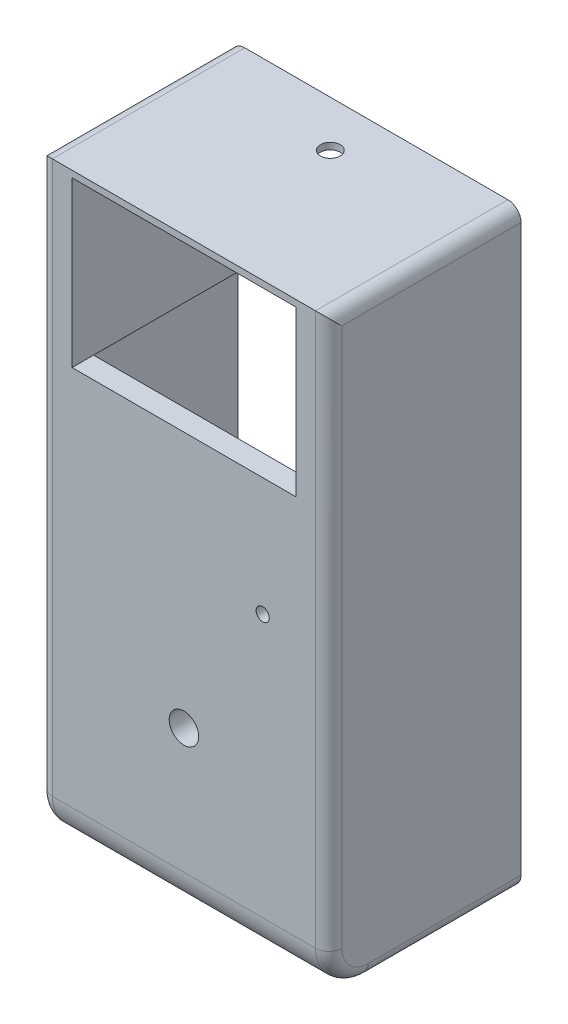
ISO-10303-21;
HEADER;
FILE_DESCRIPTION(('STEP AP214'),'2;1');
FILE_NAME('part.step','',(''),(''),'','','');
FILE_SCHEMA(('AUTOMOTIVE_DESIGN { 1 0 10303 214 1 1 1 1 }'));
ENDSEC;
DATA;
#1=APPLICATION_CONTEXT('core data for automotive mechanical design processes');
#2=APPLICATION_PROTOCOL_DEFINITION('international standard','automotive_design',2000,#1);
#3=PRODUCT_CONTEXT('',#1,'mechanical');
#4=PRODUCT('Part','Part','',(#3));
#5=PRODUCT_RELATED_PRODUCT_CATEGORY('part','',(#4));
#6=PRODUCT_DEFINITION_FORMATION('','',#4);
#7=PRODUCT_DEFINITION_CONTEXT('part definition',#1,'design');
#8=PRODUCT_DEFINITION('design','',#6,#7);
#9=PRODUCT_DEFINITION_SHAPE('','',#8);
#10=(LENGTH_UNIT() NAMED_UNIT(*) SI_UNIT(.MILLI.,.METRE.));
#11=(NAMED_UNIT(*) PLANE_ANGLE_UNIT() SI_UNIT($,.RADIAN.));
#12=(NAMED_UNIT(*) SI_UNIT($,.STERADIAN.) SOLID_ANGLE_UNIT());
#13=UNCERTAINTY_MEASURE_WITH_UNIT(LENGTH_MEASURE(1.E-05),#10,'distance_accuracy_value','');
#14=(GEOMETRIC_REPRESENTATION_CONTEXT(3) GLOBAL_UNCERTAINTY_ASSIGNED_CONTEXT((#13)) GLOBAL_UNIT_ASSIGNED_CONTEXT((#10,
#11,#12)) REPRESENTATION_CONTEXT('',''));
#15=CARTESIAN_POINT('',(0.,0.,0.));
#16=DIRECTION('',(0.,0.,1.));
#17=DIRECTION('',(1.,0.,0.));
#18=AXIS2_PLACEMENT_3D('',#15,#16,#17);
#19=CARTESIAN_POINT('',(380.4,-260.,260.));
#20=DIRECTION('',(0.,1.,0.));
#21=DIRECTION('',(0.,0.,1.));
#22=AXIS2_PLACEMENT_3D('',#19,#20,#21);
#23=PLANE('',#22);
#24=DIRECTION('',(1.,0.,0.));
#25=VECTOR('',#24,1.);
#26=CARTESIAN_POINT('',(380.4,-260.,260.));
#27=LINE('',#26,#25);
#28=CARTESIAN_POINT('',(340.4,-260.,260.));
#29=VERTEX_POINT('',#28);
#30=CARTESIAN_POINT('',(380.4,-260.,260.));
#31=VERTEX_POINT('',#30);
#32=EDGE_CURVE('E241',#29,#31,#27,.T.);
#33=ORIENTED_EDGE('',*,*,#32,.F.);
#34=DIRECTION('',(0.,0.,1.));
#35=VECTOR('',#34,1.);
#36=CARTESIAN_POINT('',(340.4,-260.,0.));
#37=LINE('',#36,#35);
#38=CARTESIAN_POINT('',(340.4,-260.,0.));
#39=VERTEX_POINT('',#38);
#40=EDGE_CURVE('E230',#39,#29,#37,.T.);
#41=ORIENTED_EDGE('',*,*,#40,.F.);
#42=DIRECTION('',(1.,0.,0.));
#43=VECTOR('',#42,1.);
#44=CARTESIAN_POINT('',(380.4,-260.,0.));
#45=LINE('',#44,#43);
#46=CARTESIAN_POINT('',(380.4,-260.,0.));
#47=VERTEX_POINT('',#46);
#48=EDGE_CURVE('E260',#39,#47,#45,.T.);
#49=ORIENTED_EDGE('',*,*,#48,.T.);
#50=DIRECTION('',(0.,0.,-1.));
#51=VECTOR('',#50,1.);
#52=CARTESIAN_POINT('',(380.4,-260.,260.));
#53=LINE('',#52,#51);
#54=EDGE_CURVE('E278',#31,#47,#53,.T.);
#55=ORIENTED_EDGE('',*,*,#54,.F.);
#56=EDGE_LOOP('',(#33,#41,#49,#55));
#57=FACE_BOUND('',#56,.T.);
#58=ADVANCED_FACE('F51',(#57),#23,.F.);
#59=CARTESIAN_POINT('',(-50.,0.,292.7));
#60=DIRECTION('',(-1.,0.,0.));
#61=DIRECTION('',(0.,0.,1.));
#62=AXIS2_PLACEMENT_3D('',#59,#60,#61);
#63=PLANE('',#62);
#64=CARTESIAN_POINT('',(-50.,-840.,232.7));
#65=DIRECTION('',(-1.,0.,0.));
#66=DIRECTION('',(0.,0.,1.));
#67=AXIS2_PLACEMENT_3D('',#64,#65,#66);
#68=CIRCLE('',#67,40.);
#69=CARTESIAN_POINT('',(-50.,-840.,272.7));
#70=VERTEX_POINT('',#69);
#71=CARTESIAN_POINT('',(-50.,-880.,232.7));
#72=VERTEX_POINT('',#71);
#73=EDGE_CURVE('E395',#70,#72,#68,.F.);
#74=ORIENTED_EDGE('',*,*,#73,.F.);
#75=DIRECTION('',(0.,1.,0.));
#76=VECTOR('',#75,1.);
#77=CARTESIAN_POINT('',(-50.,0.,272.7));
#78=LINE('',#77,#76);
#79=CARTESIAN_POINT('',(-50.,-20.,272.7));
#80=VERTEX_POINT('',#79);
#81=EDGE_CURVE('E356',#70,#80,#78,.T.);
#82=ORIENTED_EDGE('',*,*,#81,.T.);
#83=DIRECTION('',(0.,0.,-1.));
#84=VECTOR('',#83,1.);
#85=CARTESIAN_POINT('',(-50.,-20.,0.));
#86=LINE('',#85,#84);
#87=CARTESIAN_POINT('',(-50.,-20.,0.));
#88=VERTEX_POINT('',#87);
#89=EDGE_CURVE('E359',#80,#88,#86,.T.);
#90=ORIENTED_EDGE('',*,*,#89,.T.);
#91=DIRECTION('',(0.,1.,0.));
#92=VECTOR('',#91,1.);
#93=CARTESIAN_POINT('',(-50.,0.,0.));
#94=LINE('',#93,#92);
#95=CARTESIAN_POINT('',(-50.,-880.,0.));
#96=VERTEX_POINT('',#95);
#97=EDGE_CURVE('E303',#96,#88,#94,.T.);
#98=ORIENTED_EDGE('',*,*,#97,.F.);
#99=DIRECTION('',(0.,0.,-1.));
#100=VECTOR('',#99,1.);
#101=CARTESIAN_POINT('',(-50.,-880.,292.7));
#102=LINE('',#101,#100);
#103=EDGE_CURVE('E352',#96,#72,#102,.F.);
#104=ORIENTED_EDGE('',*,*,#103,.T.);
#105=EDGE_LOOP('',(#74,#82,#90,#98,#104));
#106=FACE_BOUND('',#105,.T.);
#107=ADVANCED_FACE('F481',(#106),#63,.T.);
#108=CARTESIAN_POINT('',(390.4,0.,292.7));
#109=DIRECTION('',(1.,0.,0.));
#110=DIRECTION('',(0.,1.,0.));
#111=AXIS2_PLACEMENT_3D('',#108,#109,#110);
#112=PLANE('',#111);
#113=CARTESIAN_POINT('',(390.4,-840.,232.7));
#114=DIRECTION('',(1.,0.,0.));
#115=DIRECTION('',(0.,1.,0.));
#116=AXIS2_PLACEMENT_3D('',#113,#114,#115);
#117=CIRCLE('',#116,40.);
#118=CARTESIAN_POINT('',(390.4,-880.,232.7));
#119=VERTEX_POINT('',#118);
#120=CARTESIAN_POINT('',(390.4,-840.,272.7));
#121=VERTEX_POINT('',#120);
#122=EDGE_CURVE('E377',#119,#121,#117,.F.);
#123=ORIENTED_EDGE('',*,*,#122,.F.);
#124=DIRECTION('',(0.,0.,-1.));
#125=VECTOR('',#124,1.);
#126=CARTESIAN_POINT('',(390.4,-880.,0.));
#127=LINE('',#126,#125);
#128=CARTESIAN_POINT('',(390.4,-880.,0.));
#129=VERTEX_POINT('',#128);
#130=EDGE_CURVE('E342',#119,#129,#127,.T.);
#131=ORIENTED_EDGE('',*,*,#130,.T.);
#132=DIRECTION('',(0.,-1.,0.));
#133=VECTOR('',#132,1.);
#134=CARTESIAN_POINT('',(390.4,0.,0.));
#135=LINE('',#134,#133);
#136=CARTESIAN_POINT('',(390.4,-20.,0.));
#137=VERTEX_POINT('',#136);
#138=EDGE_CURVE('E298',#137,#129,#135,.T.);
#139=ORIENTED_EDGE('',*,*,#138,.F.);
#140=DIRECTION('',(0.,0.,-1.));
#141=VECTOR('',#140,1.);
#142=CARTESIAN_POINT('',(390.4,-20.,292.7));
#143=LINE('',#142,#141);
#144=CARTESIAN_POINT('',(390.4,-20.,272.7));
#145=VERTEX_POINT('',#144);
#146=EDGE_CURVE('E349',#137,#145,#143,.F.);
#147=ORIENTED_EDGE('',*,*,#146,.T.);
#148=DIRECTION('',(0.,-1.,0.));
#149=VECTOR('',#148,1.);
#150=CARTESIAN_POINT('',(390.4,0.,272.7));
#151=LINE('',#150,#149);
#152=EDGE_CURVE('E345',#145,#121,#151,.T.);
#153=ORIENTED_EDGE('',*,*,#152,.T.);
#154=EDGE_LOOP('',(#123,#131,#139,#147,#153));
#155=FACE_BOUND('',#154,.T.);
#156=ADVANCED_FACE('F466',(#155),#112,.T.);
#157=CARTESIAN_POINT('',(1.10218211923262E-13,-900.,292.7));
#158=DIRECTION('',(0.,1.,0.));
#159=DIRECTION('',(0.,0.,1.));
#160=AXIS2_PLACEMENT_3D('',#157,#158,#159);
#161=PLANE('',#160);
#162=DIRECTION('',(0.,0.,-1.));
#163=VECTOR('',#162,1.);
#164=CARTESIAN_POINT('',(370.4,-900.,292.7));
#165=LINE('',#164,#163);
#166=CARTESIAN_POINT('',(370.4,-900.,0.));
#167=VERTEX_POINT('',#166);
#168=CARTESIAN_POINT('',(370.4,-900.,232.7));
#169=VERTEX_POINT('',#168);
#170=EDGE_CURVE('E370',#167,#169,#165,.F.);
#171=ORIENTED_EDGE('',*,*,#170,.T.);
#172=DIRECTION('',(1.,0.,0.));
#173=VECTOR('',#172,1.);
#174=CARTESIAN_POINT('',(-30.,-900.,232.7));
#175=LINE('',#174,#173);
#176=CARTESIAN_POINT('',(-30.,-900.,232.7));
#177=VERTEX_POINT('',#176);
#178=EDGE_CURVE('E11',#169,#177,#175,.F.);
#179=ORIENTED_EDGE('',*,*,#178,.T.);
#180=DIRECTION('',(0.,0.,-1.));
#181=VECTOR('',#180,1.);
#182=CARTESIAN_POINT('',(-30.,-900.,0.));
#183=LINE('',#182,#181);
#184=CARTESIAN_POINT('',(-30.,-900.,0.));
#185=VERTEX_POINT('',#184);
#186=EDGE_CURVE('E374',#177,#185,#183,.T.);
#187=ORIENTED_EDGE('',*,*,#186,.T.);
#188=DIRECTION('',(1.,0.,0.));
#189=VECTOR('',#188,1.);
#190=CARTESIAN_POINT('',(1.10218211923262E-13,-900.,0.));
#191=LINE('',#190,#189);
#192=EDGE_CURVE('E311',#185,#167,#191,.T.);
#193=ORIENTED_EDGE('',*,*,#192,.T.);
#194=EDGE_LOOP('',(#171,#179,#187,#193));
#195=FACE_BOUND('',#194,.T.);
#196=ADVANCED_FACE('F560',(#195),#161,.F.);
#197=CARTESIAN_POINT('',(0.,0.,292.7));
#198=DIRECTION('',(0.,-1.,0.));
#199=DIRECTION('',(0.,0.,-1.));
#200=AXIS2_PLACEMENT_3D('',#197,#198,#199);
#201=PLANE('',#200);
#202=CARTESIAN_POINT('',(170.2,0.,70.));
#203=DIRECTION('',(0.,1.,0.));
#204=DIRECTION('',(0.,0.,1.));
#205=AXIS2_PLACEMENT_3D('',#202,#203,#204);
#206=CIRCLE('',#205,15.);
#207=CARTESIAN_POINT('',(170.2,0.,85.0000000000001));
#208=VERTEX_POINT('',#207);
#209=EDGE_CURVE('E289',#208,#208,#206,.T.);
#210=ORIENTED_EDGE('',*,*,#209,.F.);
#211=EDGE_LOOP('',(#210));
#212=FACE_BOUND('',#211,.T.);
#213=DIRECTION('',(-1.,0.,0.));
#214=VECTOR('',#213,1.);
#215=CARTESIAN_POINT('',(0.,0.,292.7));
#216=LINE('',#215,#214);
#217=CARTESIAN_POINT('',(370.4,0.,292.7));
#218=VERTEX_POINT('',#217);
#219=CARTESIAN_POINT('',(-30.,0.,292.7));
#220=VERTEX_POINT('',#219);
#221=EDGE_CURVE('E312',#218,#220,#216,.T.);
#222=ORIENTED_EDGE('',*,*,#221,.F.);
#223=DIRECTION('',(0.,0.,-1.));
#224=VECTOR('',#223,1.);
#225=CARTESIAN_POINT('',(370.4,0.,0.));
#226=LINE('',#225,#224);
#227=CARTESIAN_POINT('',(370.4,0.,0.));
#228=VERTEX_POINT('',#227);
#229=EDGE_CURVE('E326',#218,#228,#226,.T.);
#230=ORIENTED_EDGE('',*,*,#229,.T.);
#231=DIRECTION('',(-1.,0.,0.));
#232=VECTOR('',#231,1.);
#233=CARTESIAN_POINT('',(0.,0.,0.));
#234=LINE('',#233,#232);
#235=CARTESIAN_POINT('',(-30.,0.,0.));
#236=VERTEX_POINT('',#235);
#237=EDGE_CURVE('E317',#228,#236,#234,.T.);
#238=ORIENTED_EDGE('',*,*,#237,.T.);
#239=DIRECTION('',(0.,0.,-1.));
#240=VECTOR('',#239,1.);
#241=CARTESIAN_POINT('',(-30.,0.,292.7));
#242=LINE('',#241,#240);
#243=EDGE_CURVE('E316',#236,#220,#242,.F.);
#244=ORIENTED_EDGE('',*,*,#243,.T.);
#245=EDGE_LOOP('',(#222,#230,#238,#244));
#246=FACE_BOUND('',#245,.T.);
#247=ADVANCED_FACE('F440',(#212,#246),#201,.F.);
#248=CARTESIAN_POINT('',(0.,0.,292.7));
#249=DIRECTION('',(0.,0.,1.));
#250=DIRECTION('',(1.,0.,0.));
#251=AXIS2_PLACEMENT_3D('',#248,#249,#250);
#252=PLANE('',#251);
#253=DIRECTION('',(0.,1.,0.));
#254=VECTOR('',#253,1.);
#255=CARTESIAN_POINT('',(340.4,-260.,292.7));
#256=LINE('',#255,#254);
#257=CARTESIAN_POINT('',(340.4,-260.,292.7));
#258=VERTEX_POINT('',#257);
#259=CARTESIAN_POINT('',(340.4,-10.,292.7));
#260=VERTEX_POINT('',#259);
#261=EDGE_CURVE('E69',#258,#260,#256,.T.);
#262=ORIENTED_EDGE('',*,*,#261,.F.);
#263=DIRECTION('',(1.,0.,0.));
#264=VECTOR('',#263,1.);
#265=CARTESIAN_POINT('',(0.,-260.,292.7));
#266=LINE('',#265,#264);
#267=CARTESIAN_POINT('',(0.,-260.,292.7));
#268=VERTEX_POINT('',#267);
#269=EDGE_CURVE('E214',#268,#258,#266,.T.);
#270=ORIENTED_EDGE('',*,*,#269,.F.);
#271=DIRECTION('',(0.,-1.,0.));
#272=VECTOR('',#271,1.);
#273=CARTESIAN_POINT('',(0.,-10.0000000000001,292.7));
#274=LINE('',#273,#272);
#275=CARTESIAN_POINT('',(0.,-10.0000000000001,292.7));
#276=VERTEX_POINT('',#275);
#277=EDGE_CURVE('E221',#276,#268,#274,.T.);
#278=ORIENTED_EDGE('',*,*,#277,.F.);
#279=DIRECTION('',(-1.,0.,0.));
#280=VECTOR('',#279,1.);
#281=CARTESIAN_POINT('',(170.2,-10.,292.7));
#282=LINE('',#281,#280);
#283=EDGE_CURVE('E192',#260,#276,#282,.T.);
#284=ORIENTED_EDGE('',*,*,#283,.F.);
#285=EDGE_LOOP('',(#262,#270,#278,#284));
#286=FACE_BOUND('',#285,.T.);
#287=CARTESIAN_POINT('',(290.,-440.,292.7));
#288=DIRECTION('',(0.,0.,1.));
#289=DIRECTION('',(1.,0.,0.));
#290=AXIS2_PLACEMENT_3D('',#287,#288,#289);
#291=CIRCLE('',#290,9.99999999999998);
#292=CARTESIAN_POINT('',(300.,-440.,292.7));
#293=VERTEX_POINT('',#292);
#294=EDGE_CURVE('E293',#293,#293,#291,.T.);
#295=ORIENTED_EDGE('',*,*,#294,.F.);
#296=EDGE_LOOP('',(#295));
#297=FACE_BOUND('',#296,.T.);
#298=CARTESIAN_POINT('',(170.2,-650.,292.7));
#299=DIRECTION('',(0.,0.,1.));
#300=DIRECTION('',(1.,0.,0.));
#301=AXIS2_PLACEMENT_3D('',#298,#299,#300);
#302=CIRCLE('',#301,22.5);
#303=CARTESIAN_POINT('',(192.7,-650.,292.7));
#304=VERTEX_POINT('',#303);
#305=EDGE_CURVE('E302',#304,#304,#302,.T.);
#306=ORIENTED_EDGE('',*,*,#305,.F.);
#307=EDGE_LOOP('',(#306));
#308=FACE_BOUND('',#307,.T.);
#309=DIRECTION('',(0.,1.,0.));
#310=VECTOR('',#309,1.);
#311=CARTESIAN_POINT('',(-30.,0.,292.7));
#312=LINE('',#311,#310);
#313=CARTESIAN_POINT('',(-30.,-840.,292.7));
#314=VERTEX_POINT('',#313);
#315=EDGE_CURVE('E366',#220,#314,#312,.F.);
#316=ORIENTED_EDGE('',*,*,#315,.T.);
#317=DIRECTION('',(1.,0.,0.));
#318=VECTOR('',#317,1.);
#319=CARTESIAN_POINT('',(370.4,-840.,292.7));
#320=LINE('',#319,#318);
#321=CARTESIAN_POINT('',(370.4,-840.,292.7));
#322=VERTEX_POINT('',#321);
#323=EDGE_CURVE('E61',#314,#322,#320,.T.);
#324=ORIENTED_EDGE('',*,*,#323,.T.);
#325=DIRECTION('',(0.,-1.,0.));
#326=VECTOR('',#325,1.);
#327=CARTESIAN_POINT('',(370.4,0.,292.7));
#328=LINE('',#327,#326);
#329=EDGE_CURVE('E363',#322,#218,#328,.F.);
#330=ORIENTED_EDGE('',*,*,#329,.T.);
#331=ORIENTED_EDGE('',*,*,#221,.T.);
#332=EDGE_LOOP('',(#316,#324,#330,#331));
#333=FACE_BOUND('',#332,.T.);
#334=ADVANCED_FACE('F437',(#286,#297,#308,#333),#252,.T.);
#335=CARTESIAN_POINT('',(0.,0.,0.));
#336=DIRECTION('',(0.,0.,1.));
#337=DIRECTION('',(1.,0.,0.));
#338=AXIS2_PLACEMENT_3D('',#335,#336,#337);
#339=PLANE('',#338);
#340=ORIENTED_EDGE('',*,*,#48,.F.);
#341=DIRECTION('',(0.,1.,0.));
#342=VECTOR('',#341,1.);
#343=CARTESIAN_POINT('',(340.4,-260.,0.));
#344=LINE('',#343,#342);
#345=CARTESIAN_POINT('',(340.4,-10.,0.));
#346=VERTEX_POINT('',#345);
#347=EDGE_CURVE('E195',#39,#346,#344,.T.);
#348=ORIENTED_EDGE('',*,*,#347,.T.);
#349=DIRECTION('',(-1.,0.,0.));
#350=VECTOR('',#349,1.);
#351=CARTESIAN_POINT('',(170.2,-10.,0.));
#352=LINE('',#351,#350);
#353=CARTESIAN_POINT('',(0.,-10.0000000000001,0.));
#354=VERTEX_POINT('',#353);
#355=EDGE_CURVE('E189',#346,#354,#352,.T.);
#356=ORIENTED_EDGE('',*,*,#355,.T.);
#357=DIRECTION('',(0.,-1.,0.));
#358=VECTOR('',#357,1.);
#359=CARTESIAN_POINT('',(0.,-10.0000000000001,0.));
#360=LINE('',#359,#358);
#361=CARTESIAN_POINT('',(0.,-260.,0.));
#362=VERTEX_POINT('',#361);
#363=EDGE_CURVE('E198',#354,#362,#360,.T.);
#364=ORIENTED_EDGE('',*,*,#363,.T.);
#365=CARTESIAN_POINT('',(-40.,-260.,0.));
#366=VERTEX_POINT('',#365);
#367=EDGE_CURVE('E261',#366,#362,#45,.T.);
#368=ORIENTED_EDGE('',*,*,#367,.F.);
#369=DIRECTION('',(0.,1.,0.));
#370=VECTOR('',#369,1.);
#371=CARTESIAN_POINT('',(-40.,-890.,0.));
#372=LINE('',#371,#370);
#373=CARTESIAN_POINT('',(-40.,-890.,0.));
#374=VERTEX_POINT('',#373);
#375=EDGE_CURVE('E257',#374,#366,#372,.T.);
#376=ORIENTED_EDGE('',*,*,#375,.F.);
#377=DIRECTION('',(-1.,0.,0.));
#378=VECTOR('',#377,1.);
#379=CARTESIAN_POINT('',(380.4,-890.,0.));
#380=LINE('',#379,#378);
#381=CARTESIAN_POINT('',(380.4,-890.,0.));
#382=VERTEX_POINT('',#381);
#383=EDGE_CURVE('E242',#382,#374,#380,.T.);
#384=ORIENTED_EDGE('',*,*,#383,.F.);
#385=DIRECTION('',(0.,-1.,0.));
#386=VECTOR('',#385,1.);
#387=CARTESIAN_POINT('',(380.4,-260.,0.));
#388=LINE('',#387,#386);
#389=EDGE_CURVE('E264',#47,#382,#388,.T.);
#390=ORIENTED_EDGE('',*,*,#389,.F.);
#391=EDGE_LOOP('',(#340,#348,#356,#364,#368,#376,#384,#390));
#392=FACE_BOUND('',#391,.T.);
#393=ORIENTED_EDGE('',*,*,#237,.F.);
#394=CARTESIAN_POINT('',(370.4,-20.,0.));
#395=DIRECTION('',(0.,0.,1.));
#396=DIRECTION('',(1.,0.,0.));
#397=AXIS2_PLACEMENT_3D('',#394,#395,#396);
#398=CIRCLE('',#397,20.);
#399=EDGE_CURVE('E339',#228,#137,#398,.F.);
#400=ORIENTED_EDGE('',*,*,#399,.T.);
#401=ORIENTED_EDGE('',*,*,#138,.T.);
#402=CARTESIAN_POINT('',(370.4,-880.,0.));
#403=DIRECTION('',(0.,0.,1.));
#404=DIRECTION('',(1.,0.,0.));
#405=AXIS2_PLACEMENT_3D('',#402,#403,#404);
#406=CIRCLE('',#405,20.);
#407=EDGE_CURVE('E330',#129,#167,#406,.F.);
#408=ORIENTED_EDGE('',*,*,#407,.T.);
#409=ORIENTED_EDGE('',*,*,#192,.F.);
#410=CARTESIAN_POINT('',(-30.,-880.,0.));
#411=DIRECTION('',(0.,0.,1.));
#412=DIRECTION('',(1.,0.,0.));
#413=AXIS2_PLACEMENT_3D('',#410,#411,#412);
#414=CIRCLE('',#413,20.);
#415=EDGE_CURVE('E333',#185,#96,#414,.F.);
#416=ORIENTED_EDGE('',*,*,#415,.T.);
#417=ORIENTED_EDGE('',*,*,#97,.T.);
#418=CARTESIAN_POINT('',(-30.,-20.,0.));
#419=DIRECTION('',(0.,0.,1.));
#420=DIRECTION('',(1.,0.,0.));
#421=AXIS2_PLACEMENT_3D('',#418,#419,#420);
#422=CIRCLE('',#421,20.);
#423=EDGE_CURVE('E336',#88,#236,#422,.F.);
#424=ORIENTED_EDGE('',*,*,#423,.T.);
#425=EDGE_LOOP('',(#393,#400,#401,#408,#409,#416,#417,#424));
#426=FACE_BOUND('',#425,.T.);
#427=ADVANCED_FACE('F208',(#392,#426),#339,.F.);
#428=CARTESIAN_POINT('',(170.2,-650.,0.));
#429=DIRECTION('',(0.,0.,1.));
#430=DIRECTION('',(1.,0.,0.));
#431=AXIS2_PLACEMENT_3D('',#428,#429,#430);
#432=CYLINDRICAL_SURFACE('',#431,22.5);
#433=CARTESIAN_POINT('',(170.2,-650.,260.));
#434=DIRECTION('',(0.,0.,1.));
#435=DIRECTION('',(1.,0.,0.));
#436=AXIS2_PLACEMENT_3D('',#433,#434,#435);
#437=CIRCLE('',#436,22.5);
#438=CARTESIAN_POINT('',(192.7,-650.,260.));
#439=VERTEX_POINT('',#438);
#440=EDGE_CURVE('E285',#439,#439,#437,.F.);
#441=ORIENTED_EDGE('',*,*,#440,.T.);
#442=EDGE_LOOP('',(#441));
#443=FACE_BOUND('',#442,.T.);
#444=ORIENTED_EDGE('',*,*,#305,.T.);
#445=EDGE_LOOP('',(#444));
#446=FACE_BOUND('',#445,.T.);
#447=ADVANCED_FACE('F430',(#443,#446),#432,.F.);
#448=CARTESIAN_POINT('',(370.4,-880.,292.7));
#449=DIRECTION('',(0.,0.,1.));
#450=DIRECTION('',(1.,0.,0.));
#451=AXIS2_PLACEMENT_3D('',#448,#449,#450);
#452=CYLINDRICAL_SURFACE('',#451,20.);
#453=ORIENTED_EDGE('',*,*,#130,.F.);
#454=CARTESIAN_POINT('',(370.4,-880.,232.7));
#455=DIRECTION('',(0.,0.,-1.));
#456=DIRECTION('',(-1.,0.,0.));
#457=AXIS2_PLACEMENT_3D('',#454,#455,#456);
#458=CIRCLE('',#457,20.);
#459=EDGE_CURVE('E402',#119,#169,#458,.T.);
#460=ORIENTED_EDGE('',*,*,#459,.T.);
#461=ORIENTED_EDGE('',*,*,#170,.F.);
#462=ORIENTED_EDGE('',*,*,#407,.F.);
#463=EDGE_LOOP('',(#453,#460,#461,#462));
#464=FACE_BOUND('',#463,.T.);
#465=ADVANCED_FACE('F433',(#464),#452,.T.);
#466=CARTESIAN_POINT('',(370.4,0.,272.7));
#467=DIRECTION('',(0.,-1.,0.));
#468=DIRECTION('',(1.,0.,0.));
#469=AXIS2_PLACEMENT_3D('',#466,#467,#468);
#470=CYLINDRICAL_SURFACE('',#469,20.);
#471=ORIENTED_EDGE('',*,*,#329,.F.);
#472=CARTESIAN_POINT('',(370.4,-840.,272.7));
#473=DIRECTION('',(0.,1.,0.));
#474=DIRECTION('',(0.,0.,1.));
#475=AXIS2_PLACEMENT_3D('',#472,#473,#474);
#476=CIRCLE('',#475,20.);
#477=EDGE_CURVE('E389',#322,#121,#476,.T.);
#478=ORIENTED_EDGE('',*,*,#477,.T.);
#479=ORIENTED_EDGE('',*,*,#152,.F.);
#480=CARTESIAN_POINT('',(370.4,-20.,272.7));
#481=DIRECTION('',(0.,-0.707106781186547,0.707106781186547));
#482=DIRECTION('',(0.,-0.707106781186547,-0.707106781186547));
#483=AXIS2_PLACEMENT_3D('',#480,#481,#482);
#484=ELLIPSE('',#483,28.2842712474619,20.);
#485=EDGE_CURVE('E307',#218,#145,#484,.F.);
#486=ORIENTED_EDGE('',*,*,#485,.F.);
#487=EDGE_LOOP('',(#471,#478,#479,#486));
#488=FACE_BOUND('',#487,.T.);
#489=ADVANCED_FACE('F463',(#488),#470,.T.);
#490=CARTESIAN_POINT('',(370.4,-20.,292.7));
#491=DIRECTION('',(0.,0.,1.));
#492=DIRECTION('',(1.,0.,0.));
#493=AXIS2_PLACEMENT_3D('',#490,#491,#492);
#494=CYLINDRICAL_SURFACE('',#493,20.);
#495=ORIENTED_EDGE('',*,*,#485,.T.);
#496=ORIENTED_EDGE('',*,*,#146,.F.);
#497=ORIENTED_EDGE('',*,*,#399,.F.);
#498=ORIENTED_EDGE('',*,*,#229,.F.);
#499=EDGE_LOOP('',(#495,#496,#497,#498));
#500=FACE_BOUND('',#499,.T.);
#501=ADVANCED_FACE('F471',(#500),#494,.T.);
#502=CARTESIAN_POINT('',(-30.,-880.,292.7));
#503=DIRECTION('',(0.,0.,1.));
#504=DIRECTION('',(1.,0.,0.));
#505=AXIS2_PLACEMENT_3D('',#502,#503,#504);
#506=CYLINDRICAL_SURFACE('',#505,20.);
#507=ORIENTED_EDGE('',*,*,#186,.F.);
#508=CARTESIAN_POINT('',(-30.,-880.,232.7));
#509=DIRECTION('',(0.,0.,-1.));
#510=DIRECTION('',(-1.,0.,0.));
#511=AXIS2_PLACEMENT_3D('',#508,#509,#510);
#512=CIRCLE('',#511,20.);
#513=EDGE_CURVE('E392',#177,#72,#512,.T.);
#514=ORIENTED_EDGE('',*,*,#513,.T.);
#515=ORIENTED_EDGE('',*,*,#103,.F.);
#516=ORIENTED_EDGE('',*,*,#415,.F.);
#517=EDGE_LOOP('',(#507,#514,#515,#516));
#518=FACE_BOUND('',#517,.T.);
#519=ADVANCED_FACE('F486',(#518),#506,.T.);
#520=CARTESIAN_POINT('',(-30.,0.,272.7));
#521=DIRECTION('',(0.,1.,0.));
#522=DIRECTION('',(0.,0.,1.));
#523=AXIS2_PLACEMENT_3D('',#520,#521,#522);
#524=CYLINDRICAL_SURFACE('',#523,20.);
#525=ORIENTED_EDGE('',*,*,#81,.F.);
#526=CARTESIAN_POINT('',(-30.,-840.,272.7));
#527=DIRECTION('',(0.,1.,0.));
#528=DIRECTION('',(0.,0.,1.));
#529=AXIS2_PLACEMENT_3D('',#526,#527,#528);
#530=CIRCLE('',#529,20.);
#531=EDGE_CURVE('E399',#70,#314,#530,.T.);
#532=ORIENTED_EDGE('',*,*,#531,.T.);
#533=ORIENTED_EDGE('',*,*,#315,.F.);
#534=CARTESIAN_POINT('',(-30.,-20.,272.7));
#535=DIRECTION('',(0.,0.707106781186547,-0.707106781186547));
#536=DIRECTION('',(0.,0.707106781186547,0.707106781186547));
#537=AXIS2_PLACEMENT_3D('',#534,#535,#536);
#538=ELLIPSE('',#537,28.2842712474619,20.);
#539=EDGE_CURVE('E381',#80,#220,#538,.T.);
#540=ORIENTED_EDGE('',*,*,#539,.F.);
#541=EDGE_LOOP('',(#525,#532,#533,#540));
#542=FACE_BOUND('',#541,.T.);
#543=ADVANCED_FACE('F484',(#542),#524,.T.);
#544=CARTESIAN_POINT('',(-30.,-20.,292.7));
#545=DIRECTION('',(0.,0.,1.));
#546=DIRECTION('',(1.,0.,0.));
#547=AXIS2_PLACEMENT_3D('',#544,#545,#546);
#548=CYLINDRICAL_SURFACE('',#547,20.);
#549=ORIENTED_EDGE('',*,*,#539,.T.);
#550=ORIENTED_EDGE('',*,*,#243,.F.);
#551=ORIENTED_EDGE('',*,*,#423,.F.);
#552=ORIENTED_EDGE('',*,*,#89,.F.);
#553=EDGE_LOOP('',(#549,#550,#551,#552));
#554=FACE_BOUND('',#553,.T.);
#555=ADVANCED_FACE('F479',(#554),#548,.T.);
#556=CARTESIAN_POINT('',(-30.,-840.,232.7));
#557=DIRECTION('',(-1.,0.,0.));
#558=DIRECTION('',(0.,0.,1.));
#559=AXIS2_PLACEMENT_3D('',#556,#557,#558);
#560=TOROIDAL_SURFACE('',#559,40.,20.);
#561=ORIENTED_EDGE('',*,*,#73,.T.);
#562=ORIENTED_EDGE('',*,*,#513,.F.);
#563=CARTESIAN_POINT('',(-30.,-840.,232.7));
#564=DIRECTION('',(-1.,0.,0.));
#565=DIRECTION('',(0.,0.,1.));
#566=AXIS2_PLACEMENT_3D('',#563,#564,#565);
#567=CIRCLE('',#566,60.);
#568=EDGE_CURVE('E385',#314,#177,#567,.F.);
#569=ORIENTED_EDGE('',*,*,#568,.F.);
#570=ORIENTED_EDGE('',*,*,#531,.F.);
#571=EDGE_LOOP('',(#561,#562,#569,#570));
#572=FACE_BOUND('',#571,.T.);
#573=ADVANCED_FACE('F53',(#572),#560,.T.);
#574=CARTESIAN_POINT('',(0.,-840.,232.7));
#575=DIRECTION('',(-1.,0.,0.));
#576=DIRECTION('',(0.,0.,1.));
#577=AXIS2_PLACEMENT_3D('',#574,#575,#576);
#578=CYLINDRICAL_SURFACE('',#577,60.);
#579=ORIENTED_EDGE('',*,*,#568,.T.);
#580=ORIENTED_EDGE('',*,*,#178,.F.);
#581=CARTESIAN_POINT('',(370.4,-840.,232.7));
#582=DIRECTION('',(1.,0.,0.));
#583=DIRECTION('',(0.,1.,0.));
#584=AXIS2_PLACEMENT_3D('',#581,#582,#583);
#585=CIRCLE('',#584,60.);
#586=EDGE_CURVE('E297',#322,#169,#585,.T.);
#587=ORIENTED_EDGE('',*,*,#586,.F.);
#588=ORIENTED_EDGE('',*,*,#323,.F.);
#589=EDGE_LOOP('',(#579,#580,#587,#588));
#590=FACE_BOUND('',#589,.T.);
#591=ADVANCED_FACE('F456',(#590),#578,.T.);
#592=CARTESIAN_POINT('',(370.4,-840.,232.7));
#593=DIRECTION('',(1.,0.,0.));
#594=DIRECTION('',(0.,1.,0.));
#595=AXIS2_PLACEMENT_3D('',#592,#593,#594);
#596=TOROIDAL_SURFACE('',#595,40.,20.);
#597=ORIENTED_EDGE('',*,*,#459,.F.);
#598=ORIENTED_EDGE('',*,*,#122,.T.);
#599=ORIENTED_EDGE('',*,*,#477,.F.);
#600=ORIENTED_EDGE('',*,*,#586,.T.);
#601=EDGE_LOOP('',(#597,#598,#599,#600));
#602=FACE_BOUND('',#601,.T.);
#603=ADVANCED_FACE('F459',(#602),#596,.T.);
#604=CARTESIAN_POINT('',(290.,-440.,0.));
#605=DIRECTION('',(0.,0.,1.));
#606=DIRECTION('',(1.,0.,0.));
#607=AXIS2_PLACEMENT_3D('',#604,#605,#606);
#608=CYLINDRICAL_SURFACE('',#607,9.99999999999998);
#609=CARTESIAN_POINT('',(290.,-440.,260.));
#610=DIRECTION('',(0.,0.,1.));
#611=DIRECTION('',(1.,0.,0.));
#612=AXIS2_PLACEMENT_3D('',#609,#610,#611);
#613=CIRCLE('',#612,9.99999999999998);
#614=CARTESIAN_POINT('',(300.,-440.,260.));
#615=VERTEX_POINT('',#614);
#616=EDGE_CURVE('E274',#615,#615,#613,.F.);
#617=ORIENTED_EDGE('',*,*,#616,.T.);
#618=EDGE_LOOP('',(#617));
#619=FACE_BOUND('',#618,.T.);
#620=ORIENTED_EDGE('',*,*,#294,.T.);
#621=EDGE_LOOP('',(#620));
#622=FACE_BOUND('',#621,.T.);
#623=ADVANCED_FACE('F417',(#619,#622),#608,.F.);
#624=CARTESIAN_POINT('',(170.2,-900.001,70.));
#625=DIRECTION('',(0.,1.,0.));
#626=DIRECTION('',(0.,0.,1.));
#627=AXIS2_PLACEMENT_3D('',#624,#625,#626);
#628=CYLINDRICAL_SURFACE('',#627,15.);
#629=CARTESIAN_POINT('',(170.2,-10.,70.));
#630=DIRECTION('',(0.,1.,0.));
#631=DIRECTION('',(-1.,0.,0.));
#632=AXIS2_PLACEMENT_3D('',#629,#630,#631);
#633=CIRCLE('',#632,15.);
#634=CARTESIAN_POINT('',(155.2,-10.,70.));
#635=VERTEX_POINT('',#634);
#636=EDGE_CURVE('E55',#635,#635,#633,.F.);
#637=ORIENTED_EDGE('',*,*,#636,.T.);
#638=EDGE_LOOP('',(#637));
#639=FACE_BOUND('',#638,.T.);
#640=ORIENTED_EDGE('',*,*,#209,.T.);
#641=EDGE_LOOP('',(#640));
#642=FACE_BOUND('',#641,.T.);
#643=ADVANCED_FACE('F424',(#639,#642),#628,.F.);
#644=CARTESIAN_POINT('',(0.,0.,260.));
#645=DIRECTION('',(0.,0.,1.));
#646=DIRECTION('',(1.,0.,0.));
#647=AXIS2_PLACEMENT_3D('',#644,#645,#646);
#648=PLANE('',#647);
#649=ORIENTED_EDGE('',*,*,#616,.F.);
#650=EDGE_LOOP('',(#649));
#651=FACE_BOUND('',#650,.T.);
#652=DIRECTION('',(0.,1.,0.));
#653=VECTOR('',#652,1.);
#654=CARTESIAN_POINT('',(-40.,-890.,260.));
#655=LINE('',#654,#653);
#656=CARTESIAN_POINT('',(-40.,-890.,260.));
#657=VERTEX_POINT('',#656);
#658=CARTESIAN_POINT('',(-40.,-260.,260.));
#659=VERTEX_POINT('',#658);
#660=EDGE_CURVE('E237',#657,#659,#655,.T.);
#661=ORIENTED_EDGE('',*,*,#660,.T.);
#662=CARTESIAN_POINT('',(0.,-260.,260.));
#663=VERTEX_POINT('',#662);
#664=EDGE_CURVE('E243',#659,#663,#27,.T.);
#665=ORIENTED_EDGE('',*,*,#664,.T.);
#666=EDGE_CURVE('E248',#663,#29,#27,.T.);
#667=ORIENTED_EDGE('',*,*,#666,.T.);
#668=ORIENTED_EDGE('',*,*,#32,.T.);
#669=DIRECTION('',(0.,-1.,0.));
#670=VECTOR('',#669,1.);
#671=CARTESIAN_POINT('',(380.4,-260.,260.));
#672=LINE('',#671,#670);
#673=CARTESIAN_POINT('',(380.4,-890.,260.));
#674=VERTEX_POINT('',#673);
#675=EDGE_CURVE('E247',#31,#674,#672,.T.);
#676=ORIENTED_EDGE('',*,*,#675,.T.);
#677=DIRECTION('',(-1.,0.,0.));
#678=VECTOR('',#677,1.);
#679=CARTESIAN_POINT('',(380.4,-890.,260.));
#680=LINE('',#679,#678);
#681=EDGE_CURVE('E252',#674,#657,#680,.T.);
#682=ORIENTED_EDGE('',*,*,#681,.T.);
#683=EDGE_LOOP('',(#661,#665,#667,#668,#676,#682));
#684=FACE_BOUND('',#683,.T.);
#685=ORIENTED_EDGE('',*,*,#440,.F.);
#686=EDGE_LOOP('',(#685));
#687=FACE_BOUND('',#686,.T.);
#688=ADVANCED_FACE('F420',(#651,#684,#687),#648,.F.);
#689=ORIENTED_EDGE('',*,*,#367,.T.);
#690=DIRECTION('',(0.,0.,1.));
#691=VECTOR('',#690,1.);
#692=CARTESIAN_POINT('',(0.,-260.,0.));
#693=LINE('',#692,#691);
#694=EDGE_CURVE('E201',#362,#663,#693,.T.);
#695=ORIENTED_EDGE('',*,*,#694,.T.);
#696=ORIENTED_EDGE('',*,*,#664,.F.);
#697=DIRECTION('',(0.,0.,-1.));
#698=VECTOR('',#697,1.);
#699=CARTESIAN_POINT('',(-40.,-260.,260.));
#700=LINE('',#699,#698);
#701=EDGE_CURVE('E256',#659,#366,#700,.T.);
#702=ORIENTED_EDGE('',*,*,#701,.T.);
#703=EDGE_LOOP('',(#689,#695,#696,#702));
#704=FACE_BOUND('',#703,.T.);
#705=ADVANCED_FACE('F423',(#704),#23,.F.);
#706=CARTESIAN_POINT('',(-40.,-890.,260.));
#707=DIRECTION('',(-1.,0.,0.));
#708=DIRECTION('',(0.,0.,1.));
#709=AXIS2_PLACEMENT_3D('',#706,#707,#708);
#710=PLANE('',#709);
#711=ORIENTED_EDGE('',*,*,#375,.T.);
#712=ORIENTED_EDGE('',*,*,#701,.F.);
#713=ORIENTED_EDGE('',*,*,#660,.F.);
#714=DIRECTION('',(0.,0.,-1.));
#715=VECTOR('',#714,1.);
#716=CARTESIAN_POINT('',(-40.,-890.,260.));
#717=LINE('',#716,#715);
#718=EDGE_CURVE('E271',#657,#374,#717,.T.);
#719=ORIENTED_EDGE('',*,*,#718,.T.);
#720=EDGE_LOOP('',(#711,#712,#713,#719));
#721=FACE_BOUND('',#720,.T.);
#722=ADVANCED_FACE('F507',(#721),#710,.F.);
#723=CARTESIAN_POINT('',(380.4,-890.,260.));
#724=DIRECTION('',(0.,-1.,0.));
#725=DIRECTION('',(0.,0.,-1.));
#726=AXIS2_PLACEMENT_3D('',#723,#724,#725);
#727=PLANE('',#726);
#728=ORIENTED_EDGE('',*,*,#383,.T.);
#729=ORIENTED_EDGE('',*,*,#718,.F.);
#730=ORIENTED_EDGE('',*,*,#681,.F.);
#731=DIRECTION('',(0.,0.,-1.));
#732=VECTOR('',#731,1.);
#733=CARTESIAN_POINT('',(380.4,-890.,260.));
#734=LINE('',#733,#732);
#735=EDGE_CURVE('E275',#674,#382,#734,.T.);
#736=ORIENTED_EDGE('',*,*,#735,.T.);
#737=EDGE_LOOP('',(#728,#729,#730,#736));
#738=FACE_BOUND('',#737,.T.);
#739=ADVANCED_FACE('F513',(#738),#727,.F.);
#740=CARTESIAN_POINT('',(380.4,-260.,260.));
#741=DIRECTION('',(1.,0.,0.));
#742=DIRECTION('',(0.,0.,-1.));
#743=AXIS2_PLACEMENT_3D('',#740,#741,#742);
#744=PLANE('',#743);
#745=ORIENTED_EDGE('',*,*,#389,.T.);
#746=ORIENTED_EDGE('',*,*,#735,.F.);
#747=ORIENTED_EDGE('',*,*,#675,.F.);
#748=ORIENTED_EDGE('',*,*,#54,.T.);
#749=EDGE_LOOP('',(#745,#746,#747,#748));
#750=FACE_BOUND('',#749,.T.);
#751=ADVANCED_FACE('F523',(#750),#744,.F.);
#752=CARTESIAN_POINT('',(170.2,-10.,0.));
#753=DIRECTION('',(0.,1.,0.));
#754=DIRECTION('',(-1.,0.,0.));
#755=AXIS2_PLACEMENT_3D('',#752,#753,#754);
#756=PLANE('',#755);
#757=ORIENTED_EDGE('',*,*,#283,.T.);
#758=DIRECTION('',(0.,0.,1.));
#759=VECTOR('',#758,1.);
#760=CARTESIAN_POINT('',(0.,-10.0000000000001,0.));
#761=LINE('',#760,#759);
#762=EDGE_CURVE('E184',#354,#276,#761,.T.);
#763=ORIENTED_EDGE('',*,*,#762,.F.);
#764=ORIENTED_EDGE('',*,*,#355,.F.);
#765=DIRECTION('',(0.,0.,1.));
#766=VECTOR('',#765,1.);
#767=CARTESIAN_POINT('',(340.4,-10.,0.));
#768=LINE('',#767,#766);
#769=EDGE_CURVE('E227',#346,#260,#768,.T.);
#770=ORIENTED_EDGE('',*,*,#769,.T.);
#771=EDGE_LOOP('',(#757,#763,#764,#770));
#772=FACE_BOUND('',#771,.T.);
#773=ORIENTED_EDGE('',*,*,#636,.F.);
#774=EDGE_LOOP('',(#773));
#775=FACE_BOUND('',#774,.T.);
#776=ADVANCED_FACE('F186',(#772,#775),#756,.F.);
#777=CARTESIAN_POINT('',(0.,-260.,0.));
#778=DIRECTION('',(0.,-1.,0.));
#779=DIRECTION('',(0.,0.,-1.));
#780=AXIS2_PLACEMENT_3D('',#777,#778,#779);
#781=PLANE('',#780);
#782=EDGE_CURVE('E77',#663,#268,#693,.T.);
#783=ORIENTED_EDGE('',*,*,#782,.T.);
#784=ORIENTED_EDGE('',*,*,#269,.T.);
#785=EDGE_CURVE('E234',#29,#258,#37,.T.);
#786=ORIENTED_EDGE('',*,*,#785,.F.);
#787=ORIENTED_EDGE('',*,*,#666,.F.);
#788=EDGE_LOOP('',(#783,#784,#786,#787));
#789=FACE_BOUND('',#788,.T.);
#790=ADVANCED_FACE('F544',(#789),#781,.F.);
#791=CARTESIAN_POINT('',(340.4,-260.,0.));
#792=DIRECTION('',(1.,0.,0.));
#793=DIRECTION('',(0.,0.,-1.));
#794=AXIS2_PLACEMENT_3D('',#791,#792,#793);
#795=PLANE('',#794);
#796=ORIENTED_EDGE('',*,*,#261,.T.);
#797=ORIENTED_EDGE('',*,*,#769,.F.);
#798=ORIENTED_EDGE('',*,*,#347,.F.);
#799=ORIENTED_EDGE('',*,*,#40,.T.);
#800=ORIENTED_EDGE('',*,*,#785,.T.);
#801=EDGE_LOOP('',(#796,#797,#798,#799,#800));
#802=FACE_BOUND('',#801,.T.);
#803=ADVANCED_FACE('F803',(#802),#795,.F.);
#804=CARTESIAN_POINT('',(0.,-10.0000000000001,0.));
#805=DIRECTION('',(-1.,0.,0.));
#806=DIRECTION('',(0.,0.,1.));
#807=AXIS2_PLACEMENT_3D('',#804,#805,#806);
#808=PLANE('',#807);
#809=ORIENTED_EDGE('',*,*,#277,.T.);
#810=ORIENTED_EDGE('',*,*,#782,.F.);
#811=ORIENTED_EDGE('',*,*,#694,.F.);
#812=ORIENTED_EDGE('',*,*,#363,.F.);
#813=ORIENTED_EDGE('',*,*,#762,.T.);
#814=EDGE_LOOP('',(#809,#810,#811,#812,#813));
#815=FACE_BOUND('',#814,.T.);
#816=ADVANCED_FACE('F199',(#815),#808,.F.);
#817=CLOSED_SHELL('',(#58,#107,#156,#196,#247,#334,#427,#447,#465,#489,#501,#519,#543,#555,#573,
#591,#603,#623,#643,#688,#705,#722,#739,#751,#776,#790,#803,#816));
#818=MANIFOLD_SOLID_BREP('B2',#817);
#819=ADVANCED_BREP_SHAPE_REPRESENTATION('',(#18,#818),#14);
#820=SHAPE_DEFINITION_REPRESENTATION(#9,#819);
ENDSEC;
END-ISO-10303-21;
